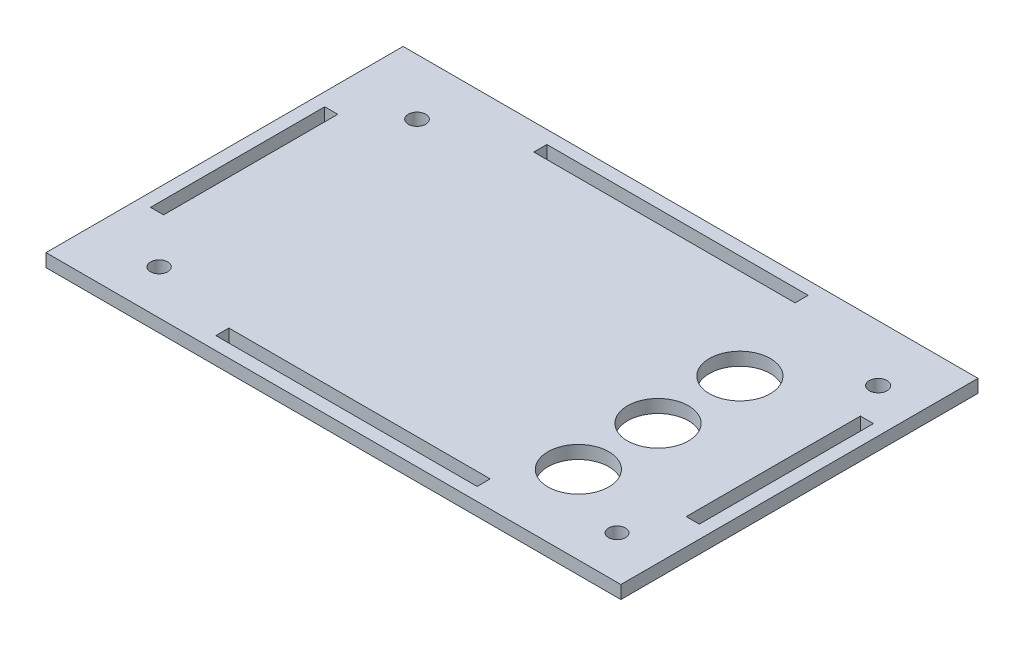
ISO-10303-21;
HEADER;
FILE_DESCRIPTION(('STEP AP214'),'2;1');
FILE_NAME('part.step','',(''),(''),'','','');
FILE_SCHEMA(('AUTOMOTIVE_DESIGN { 1 0 10303 214 1 1 1 1 }'));
ENDSEC;
DATA;
#1=APPLICATION_CONTEXT('core data for automotive mechanical design processes');
#2=APPLICATION_PROTOCOL_DEFINITION('international standard','automotive_design',2000,#1);
#3=PRODUCT_CONTEXT('',#1,'mechanical');
#4=PRODUCT('Part','Part','',(#3));
#5=PRODUCT_RELATED_PRODUCT_CATEGORY('part','',(#4));
#6=PRODUCT_DEFINITION_FORMATION('','',#4);
#7=PRODUCT_DEFINITION_CONTEXT('part definition',#1,'design');
#8=PRODUCT_DEFINITION('design','',#6,#7);
#9=PRODUCT_DEFINITION_SHAPE('','',#8);
#10=(LENGTH_UNIT() NAMED_UNIT(*) SI_UNIT(.MILLI.,.METRE.));
#11=(NAMED_UNIT(*) PLANE_ANGLE_UNIT() SI_UNIT($,.RADIAN.));
#12=(NAMED_UNIT(*) SI_UNIT($,.STERADIAN.) SOLID_ANGLE_UNIT());
#13=UNCERTAINTY_MEASURE_WITH_UNIT(LENGTH_MEASURE(1.E-05),#10,'distance_accuracy_value','');
#14=(GEOMETRIC_REPRESENTATION_CONTEXT(3) GLOBAL_UNCERTAINTY_ASSIGNED_CONTEXT((#13)) GLOBAL_UNIT_ASSIGNED_CONTEXT((#10,
#11,#12)) REPRESENTATION_CONTEXT('',''));
#15=CARTESIAN_POINT('',(0.,0.,0.));
#16=DIRECTION('',(0.,0.,1.));
#17=DIRECTION('',(1.,0.,0.));
#18=AXIS2_PLACEMENT_3D('',#15,#16,#17);
#19=CARTESIAN_POINT('',(0.,3.,0.));
#20=DIRECTION('',(0.,1.,0.));
#21=DIRECTION('',(0.,0.,1.));
#22=AXIS2_PLACEMENT_3D('',#19,#20,#21);
#23=PLANE('',#22);
#24=CARTESIAN_POINT('',(-21.7887973900198,3.,-30.3157877240987));
#25=DIRECTION('',(0.,1.,0.));
#26=DIRECTION('',(0.,0.,1.));
#27=AXIS2_PLACEMENT_3D('',#24,#25,#26);
#28=CIRCLE('',#27,7.);
#29=CARTESIAN_POINT('',(-21.7887973900198,3.,-23.3157877240987));
#30=VERTEX_POINT('',#29);
#31=EDGE_CURVE('E493',#30,#30,#28,.T.);
#32=ORIENTED_EDGE('',*,*,#31,.F.);
#33=EDGE_LOOP('',(#32));
#34=FACE_BOUND('',#33,.T.);
#35=CARTESIAN_POINT('',(-4.72023304277996,3.,-3.837756232131));
#36=DIRECTION('',(0.,1.,0.));
#37=DIRECTION('',(0.,0.,1.));
#38=AXIS2_PLACEMENT_3D('',#35,#36,#37);
#39=CIRCLE('',#38,1.9401466338825);
#40=CARTESIAN_POINT('',(-4.72023304277996,3.,-1.89760959824849));
#41=VERTEX_POINT('',#40);
#42=EDGE_CURVE('E505',#41,#41,#39,.T.);
#43=ORIENTED_EDGE('',*,*,#42,.F.);
#44=EDGE_LOOP('',(#43));
#45=FACE_BOUND('',#44,.T.);
#46=CARTESIAN_POINT('',(-110.18079739002,3.,-4.15478389289388));
#47=DIRECTION('',(0.,1.,0.));
#48=DIRECTION('',(0.,0.,1.));
#49=AXIS2_PLACEMENT_3D('',#46,#47,#48);
#50=CIRCLE('',#49,1.97327549457175);
#51=CARTESIAN_POINT('',(-110.18079739002,3.,-2.18150839832213));
#52=VERTEX_POINT('',#51);
#53=EDGE_CURVE('E517',#52,#52,#50,.T.);
#54=ORIENTED_EDGE('',*,*,#53,.F.);
#55=EDGE_LOOP('',(#54));
#56=FACE_BOUND('',#55,.T.);
#57=DIRECTION('',(1.,0.,0.));
#58=VECTOR('',#57,1.);
#59=CARTESIAN_POINT('',(-30.,3.,3.00000000000003));
#60=LINE('',#59,#58);
#61=CARTESIAN_POINT('',(-90.,3.,3.00000000000004));
#62=VERTEX_POINT('',#61);
#63=CARTESIAN_POINT('',(-30.,3.,3.00000000000003));
#64=VERTEX_POINT('',#63);
#65=EDGE_CURVE('E188',#62,#64,#60,.T.);
#66=ORIENTED_EDGE('',*,*,#65,.F.);
#67=DIRECTION('',(0.,0.,1.));
#68=VECTOR('',#67,1.);
#69=CARTESIAN_POINT('',(-90.,3.,3.00000000000004));
#70=LINE('',#69,#68);
#71=CARTESIAN_POINT('',(-90.,3.,0.));
#72=VERTEX_POINT('',#71);
#73=EDGE_CURVE('E180',#72,#62,#70,.T.);
#74=ORIENTED_EDGE('',*,*,#73,.F.);
#75=DIRECTION('',(-1.,0.,0.));
#76=VECTOR('',#75,1.);
#77=CARTESIAN_POINT('',(-30.,3.,0.));
#78=LINE('',#77,#76);
#79=CARTESIAN_POINT('',(-30.,3.,0.));
#80=VERTEX_POINT('',#79);
#81=EDGE_CURVE('E203',#80,#72,#78,.T.);
#82=ORIENTED_EDGE('',*,*,#81,.F.);
#83=DIRECTION('',(0.,0.,-1.));
#84=VECTOR('',#83,1.);
#85=CARTESIAN_POINT('',(-30.,3.,3.00000000000003));
#86=LINE('',#85,#84);
#87=EDGE_CURVE('E201',#64,#80,#86,.T.);
#88=ORIENTED_EDGE('',*,*,#87,.F.);
#89=EDGE_LOOP('',(#66,#74,#82,#88));
#90=FACE_BOUND('',#89,.T.);
#91=DIRECTION('',(1.,0.,0.));
#92=VECTOR('',#91,1.);
#93=CARTESIAN_POINT('',(-29.9999999999999,3.,-70.0000000000002));
#94=LINE('',#93,#92);
#95=CARTESIAN_POINT('',(-89.9999999999999,3.,-70.));
#96=VERTEX_POINT('',#95);
#97=CARTESIAN_POINT('',(-29.9999999999999,3.,-70.0000000000002));
#98=VERTEX_POINT('',#97);
#99=EDGE_CURVE('E221',#96,#98,#94,.T.);
#100=ORIENTED_EDGE('',*,*,#99,.F.);
#101=DIRECTION('',(0.,0.,1.));
#102=VECTOR('',#101,1.);
#103=CARTESIAN_POINT('',(-89.9999999999999,3.,-73.0000000000001));
#104=LINE('',#103,#102);
#105=CARTESIAN_POINT('',(-89.9999999999999,3.,-73.0000000000001));
#106=VERTEX_POINT('',#105);
#107=EDGE_CURVE('E219',#106,#96,#104,.T.);
#108=ORIENTED_EDGE('',*,*,#107,.F.);
#109=DIRECTION('',(-1.,0.,0.));
#110=VECTOR('',#109,1.);
#111=CARTESIAN_POINT('',(-29.9999999999999,3.,-73.0000000000001));
#112=LINE('',#111,#110);
#113=CARTESIAN_POINT('',(-29.9999999999999,3.,-73.0000000000001));
#114=VERTEX_POINT('',#113);
#115=EDGE_CURVE('E227',#114,#106,#112,.T.);
#116=ORIENTED_EDGE('',*,*,#115,.F.);
#117=DIRECTION('',(0.,0.,-1.));
#118=VECTOR('',#117,1.);
#119=CARTESIAN_POINT('',(-29.9999999999999,3.,-73.0000000000001));
#120=LINE('',#119,#118);
#121=EDGE_CURVE('E224',#98,#114,#120,.T.);
#122=ORIENTED_EDGE('',*,*,#121,.F.);
#123=EDGE_LOOP('',(#100,#108,#116,#122));
#124=FACE_BOUND('',#123,.T.);
#125=DIRECTION('',(-1.,0.,0.));
#126=VECTOR('',#125,1.);
#127=CARTESIAN_POINT('',(-123.,3.,-55.));
#128=LINE('',#127,#126);
#129=CARTESIAN_POINT('',(-120.,3.,-55.));
#130=VERTEX_POINT('',#129);
#131=CARTESIAN_POINT('',(-123.,3.,-55.));
#132=VERTEX_POINT('',#131);
#133=EDGE_CURVE('E252',#130,#132,#128,.T.);
#134=ORIENTED_EDGE('',*,*,#133,.F.);
#135=DIRECTION('',(0.,0.,-1.));
#136=VECTOR('',#135,1.);
#137=CARTESIAN_POINT('',(-120.,3.,-55.));
#138=LINE('',#137,#136);
#139=CARTESIAN_POINT('',(-120.,3.,-15.));
#140=VERTEX_POINT('',#139);
#141=EDGE_CURVE('E250',#140,#130,#138,.T.);
#142=ORIENTED_EDGE('',*,*,#141,.F.);
#143=DIRECTION('',(1.,0.,0.));
#144=VECTOR('',#143,1.);
#145=CARTESIAN_POINT('',(-123.,3.,-15.));
#146=LINE('',#145,#144);
#147=CARTESIAN_POINT('',(-123.,3.,-15.));
#148=VERTEX_POINT('',#147);
#149=EDGE_CURVE('E258',#148,#140,#146,.T.);
#150=ORIENTED_EDGE('',*,*,#149,.F.);
#151=DIRECTION('',(0.,0.,1.));
#152=VECTOR('',#151,1.);
#153=CARTESIAN_POINT('',(-123.,3.,-55.));
#154=LINE('',#153,#152);
#155=EDGE_CURVE('E255',#132,#148,#154,.T.);
#156=ORIENTED_EDGE('',*,*,#155,.F.);
#157=EDGE_LOOP('',(#134,#142,#150,#156));
#158=FACE_BOUND('',#157,.T.);
#159=DIRECTION('',(1.,0.,0.));
#160=VECTOR('',#159,1.);
#161=CARTESIAN_POINT('',(3.00000000000011,3.,-15.));
#162=LINE('',#161,#160);
#163=CARTESIAN_POINT('',(0.,3.,-15.));
#164=VERTEX_POINT('',#163);
#165=CARTESIAN_POINT('',(3.00000000000011,3.,-15.));
#166=VERTEX_POINT('',#165);
#167=EDGE_CURVE('E283',#164,#166,#162,.T.);
#168=ORIENTED_EDGE('',*,*,#167,.F.);
#169=DIRECTION('',(0.,0.,1.));
#170=VECTOR('',#169,1.);
#171=CARTESIAN_POINT('',(0.,3.,-55.));
#172=LINE('',#171,#170);
#173=CARTESIAN_POINT('',(0.,3.,-55.));
#174=VERTEX_POINT('',#173);
#175=EDGE_CURVE('E281',#174,#164,#172,.T.);
#176=ORIENTED_EDGE('',*,*,#175,.F.);
#177=DIRECTION('',(-1.,0.,0.));
#178=VECTOR('',#177,1.);
#179=CARTESIAN_POINT('',(3.00000000000001,3.,-55.));
#180=LINE('',#179,#178);
#181=CARTESIAN_POINT('',(3.00000000000001,3.,-55.));
#182=VERTEX_POINT('',#181);
#183=EDGE_CURVE('E289',#182,#174,#180,.T.);
#184=ORIENTED_EDGE('',*,*,#183,.F.);
#185=DIRECTION('',(0.,0.,-1.));
#186=VECTOR('',#185,1.);
#187=CARTESIAN_POINT('',(3.00000000000001,3.,-55.));
#188=LINE('',#187,#186);
#189=EDGE_CURVE('E286',#166,#182,#188,.T.);
#190=ORIENTED_EDGE('',*,*,#189,.F.);
#191=EDGE_LOOP('',(#168,#176,#184,#190));
#192=FACE_BOUND('',#191,.T.);
#193=DIRECTION('',(0.,0.,-1.));
#194=VECTOR('',#193,1.);
#195=CARTESIAN_POINT('',(6.,3.,5.99999999999998));
#196=LINE('',#195,#194);
#197=CARTESIAN_POINT('',(6.,3.,5.99999999999998));
#198=VERTEX_POINT('',#197);
#199=CARTESIAN_POINT('',(6.,3.,-76.0000000000001));
#200=VERTEX_POINT('',#199);
#201=EDGE_CURVE('E312',#198,#200,#196,.T.);
#202=ORIENTED_EDGE('',*,*,#201,.T.);
#203=DIRECTION('',(-1.,0.,0.));
#204=VECTOR('',#203,1.);
#205=CARTESIAN_POINT('',(6.,3.,-76.0000000000001));
#206=LINE('',#205,#204);
#207=CARTESIAN_POINT('',(-126.,3.,-76.0000000000001));
#208=VERTEX_POINT('',#207);
#209=EDGE_CURVE('E315',#200,#208,#206,.T.);
#210=ORIENTED_EDGE('',*,*,#209,.T.);
#211=DIRECTION('',(0.,0.,1.));
#212=VECTOR('',#211,1.);
#213=CARTESIAN_POINT('',(-126.,3.,6.));
#214=LINE('',#213,#212);
#215=CARTESIAN_POINT('',(-126.,3.,6.));
#216=VERTEX_POINT('',#215);
#217=EDGE_CURVE('E318',#208,#216,#214,.T.);
#218=ORIENTED_EDGE('',*,*,#217,.T.);
#219=DIRECTION('',(1.,0.,0.));
#220=VECTOR('',#219,1.);
#221=CARTESIAN_POINT('',(6.,3.,5.99999999999998));
#222=LINE('',#221,#220);
#223=EDGE_CURVE('E320',#216,#198,#222,.T.);
#224=ORIENTED_EDGE('',*,*,#223,.T.);
#225=EDGE_LOOP('',(#202,#210,#218,#224));
#226=FACE_BOUND('',#225,.T.);
#227=CARTESIAN_POINT('',(-109.92679739002,3.,-63.1137881954682));
#228=DIRECTION('',(0.,1.,0.));
#229=DIRECTION('',(0.,0.,1.));
#230=AXIS2_PLACEMENT_3D('',#227,#228,#229);
#231=CIRCLE('',#230,2.00659999999999);
#232=CARTESIAN_POINT('',(-109.92679739002,3.,-61.1071881954682));
#233=VERTEX_POINT('',#232);
#234=EDGE_CURVE('E209',#233,#233,#231,.T.);
#235=ORIENTED_EDGE('',*,*,#234,.F.);
#236=EDGE_LOOP('',(#235));
#237=FACE_BOUND('',#236,.T.);
#238=CARTESIAN_POINT('',(-4.00427744735474,3.,-63.0805400952194));
#239=DIRECTION('',(0.,1.,0.));
#240=DIRECTION('',(0.,0.,1.));
#241=AXIS2_PLACEMENT_3D('',#238,#239,#240);
#242=CIRCLE('',#241,2.03767912548017);
#243=CARTESIAN_POINT('',(-4.00427744735474,3.,-61.0428609697392));
#244=VERTEX_POINT('',#243);
#245=EDGE_CURVE('E511',#244,#244,#242,.T.);
#246=ORIENTED_EDGE('',*,*,#245,.F.);
#247=EDGE_LOOP('',(#246));
#248=FACE_BOUND('',#247,.T.);
#249=CARTESIAN_POINT('',(-21.7887973900198,3.,-49.1110720300129));
#250=DIRECTION('',(0.,1.,0.));
#251=DIRECTION('',(0.,0.,1.));
#252=AXIS2_PLACEMENT_3D('',#249,#250,#251);
#253=CIRCLE('',#252,7.);
#254=CARTESIAN_POINT('',(-21.7887973900198,3.,-42.1110720300129));
#255=VERTEX_POINT('',#254);
#256=EDGE_CURVE('E499',#255,#255,#253,.T.);
#257=ORIENTED_EDGE('',*,*,#256,.F.);
#258=EDGE_LOOP('',(#257));
#259=FACE_BOUND('',#258,.T.);
#260=CARTESIAN_POINT('',(-21.7887973900198,3.,-12.0284840751012));
#261=DIRECTION('',(0.,1.,0.));
#262=DIRECTION('',(0.,0.,1.));
#263=AXIS2_PLACEMENT_3D('',#260,#261,#262);
#264=CIRCLE('',#263,7.);
#265=CARTESIAN_POINT('',(-21.7887973900198,3.,-5.02848407510115));
#266=VERTEX_POINT('',#265);
#267=EDGE_CURVE('E484',#266,#266,#264,.T.);
#268=ORIENTED_EDGE('',*,*,#267,.F.);
#269=EDGE_LOOP('',(#268));
#270=FACE_BOUND('',#269,.T.);
#271=ADVANCED_FACE('F43',(#34,#45,#56,#90,#124,#158,#192,#226,#237,#248,#259,#270),#23,.T.);
#272=CARTESIAN_POINT('',(0.,0.,0.));
#273=DIRECTION('',(0.,1.,0.));
#274=DIRECTION('',(0.,0.,1.));
#275=AXIS2_PLACEMENT_3D('',#272,#273,#274);
#276=PLANE('',#275);
#277=DIRECTION('',(0.,0.,1.));
#278=VECTOR('',#277,1.);
#279=CARTESIAN_POINT('',(-89.9999999999999,0.,-73.0000000000001));
#280=LINE('',#279,#278);
#281=CARTESIAN_POINT('',(-89.9999999999999,0.,-73.0000000000001));
#282=VERTEX_POINT('',#281);
#283=CARTESIAN_POINT('',(-89.9999999999999,0.,-70.));
#284=VERTEX_POINT('',#283);
#285=EDGE_CURVE('E196',#282,#284,#280,.T.);
#286=ORIENTED_EDGE('',*,*,#285,.T.);
#287=DIRECTION('',(1.,0.,0.));
#288=VECTOR('',#287,1.);
#289=CARTESIAN_POINT('',(-29.9999999999999,0.,-70.0000000000002));
#290=LINE('',#289,#288);
#291=CARTESIAN_POINT('',(-29.9999999999999,0.,-70.0000000000002));
#292=VERTEX_POINT('',#291);
#293=EDGE_CURVE('E232',#284,#292,#290,.T.);
#294=ORIENTED_EDGE('',*,*,#293,.T.);
#295=DIRECTION('',(0.,0.,-1.));
#296=VECTOR('',#295,1.);
#297=CARTESIAN_POINT('',(-29.9999999999999,0.,-73.0000000000001));
#298=LINE('',#297,#296);
#299=CARTESIAN_POINT('',(-29.9999999999999,0.,-73.0000000000001));
#300=VERTEX_POINT('',#299);
#301=EDGE_CURVE('E235',#292,#300,#298,.T.);
#302=ORIENTED_EDGE('',*,*,#301,.T.);
#303=DIRECTION('',(-1.,0.,0.));
#304=VECTOR('',#303,1.);
#305=CARTESIAN_POINT('',(-29.9999999999999,0.,-73.0000000000001));
#306=LINE('',#305,#304);
#307=EDGE_CURVE('E222',#300,#282,#306,.T.);
#308=ORIENTED_EDGE('',*,*,#307,.T.);
#309=EDGE_LOOP('',(#286,#294,#302,#308));
#310=FACE_BOUND('',#309,.T.);
#311=DIRECTION('',(0.,0.,1.));
#312=VECTOR('',#311,1.);
#313=CARTESIAN_POINT('',(0.,0.,-55.));
#314=LINE('',#313,#312);
#315=CARTESIAN_POINT('',(0.,0.,-55.));
#316=VERTEX_POINT('',#315);
#317=CARTESIAN_POINT('',(0.,0.,-15.));
#318=VERTEX_POINT('',#317);
#319=EDGE_CURVE('E280',#316,#318,#314,.T.);
#320=ORIENTED_EDGE('',*,*,#319,.T.);
#321=DIRECTION('',(1.,0.,0.));
#322=VECTOR('',#321,1.);
#323=CARTESIAN_POINT('',(3.00000000000011,0.,-15.));
#324=LINE('',#323,#322);
#325=CARTESIAN_POINT('',(3.00000000000011,0.,-15.));
#326=VERTEX_POINT('',#325);
#327=EDGE_CURVE('E294',#318,#326,#324,.T.);
#328=ORIENTED_EDGE('',*,*,#327,.T.);
#329=DIRECTION('',(0.,0.,-1.));
#330=VECTOR('',#329,1.);
#331=CARTESIAN_POINT('',(3.00000000000001,0.,-55.));
#332=LINE('',#331,#330);
#333=CARTESIAN_POINT('',(3.00000000000001,0.,-55.));
#334=VERTEX_POINT('',#333);
#335=EDGE_CURVE('E297',#326,#334,#332,.T.);
#336=ORIENTED_EDGE('',*,*,#335,.T.);
#337=DIRECTION('',(-1.,0.,0.));
#338=VECTOR('',#337,1.);
#339=CARTESIAN_POINT('',(3.00000000000001,0.,-55.));
#340=LINE('',#339,#338);
#341=EDGE_CURVE('E284',#334,#316,#340,.T.);
#342=ORIENTED_EDGE('',*,*,#341,.T.);
#343=EDGE_LOOP('',(#320,#328,#336,#342));
#344=FACE_BOUND('',#343,.T.);
#345=DIRECTION('',(0.,0.,-1.));
#346=VECTOR('',#345,1.);
#347=CARTESIAN_POINT('',(6.,0.,5.99999999999998));
#348=LINE('',#347,#346);
#349=CARTESIAN_POINT('',(6.,0.,5.99999999999998));
#350=VERTEX_POINT('',#349);
#351=CARTESIAN_POINT('',(6.,0.,-76.0000000000001));
#352=VERTEX_POINT('',#351);
#353=EDGE_CURVE('E311',#350,#352,#348,.T.);
#354=ORIENTED_EDGE('',*,*,#353,.F.);
#355=DIRECTION('',(1.,0.,0.));
#356=VECTOR('',#355,1.);
#357=CARTESIAN_POINT('',(6.,0.,5.99999999999998));
#358=LINE('',#357,#356);
#359=CARTESIAN_POINT('',(-126.,0.,6.));
#360=VERTEX_POINT('',#359);
#361=EDGE_CURVE('E316',#360,#350,#358,.T.);
#362=ORIENTED_EDGE('',*,*,#361,.F.);
#363=DIRECTION('',(0.,0.,1.));
#364=VECTOR('',#363,1.);
#365=CARTESIAN_POINT('',(-126.,0.,6.));
#366=LINE('',#365,#364);
#367=CARTESIAN_POINT('',(-126.,0.,-76.0000000000001));
#368=VERTEX_POINT('',#367);
#369=EDGE_CURVE('E327',#368,#360,#366,.T.);
#370=ORIENTED_EDGE('',*,*,#369,.F.);
#371=DIRECTION('',(-1.,0.,0.));
#372=VECTOR('',#371,1.);
#373=CARTESIAN_POINT('',(6.,0.,-76.0000000000001));
#374=LINE('',#373,#372);
#375=EDGE_CURVE('E325',#352,#368,#374,.T.);
#376=ORIENTED_EDGE('',*,*,#375,.F.);
#377=EDGE_LOOP('',(#354,#362,#370,#376));
#378=FACE_BOUND('',#377,.T.);
#379=DIRECTION('',(0.,0.,-1.));
#380=VECTOR('',#379,1.);
#381=CARTESIAN_POINT('',(-120.,0.,-55.));
#382=LINE('',#381,#380);
#383=CARTESIAN_POINT('',(-120.,0.,-15.));
#384=VERTEX_POINT('',#383);
#385=CARTESIAN_POINT('',(-120.,0.,-55.));
#386=VERTEX_POINT('',#385);
#387=EDGE_CURVE('E249',#384,#386,#382,.T.);
#388=ORIENTED_EDGE('',*,*,#387,.T.);
#389=DIRECTION('',(-1.,0.,0.));
#390=VECTOR('',#389,1.);
#391=CARTESIAN_POINT('',(-123.,0.,-55.));
#392=LINE('',#391,#390);
#393=CARTESIAN_POINT('',(-123.,0.,-55.));
#394=VERTEX_POINT('',#393);
#395=EDGE_CURVE('E263',#386,#394,#392,.T.);
#396=ORIENTED_EDGE('',*,*,#395,.T.);
#397=DIRECTION('',(0.,0.,1.));
#398=VECTOR('',#397,1.);
#399=CARTESIAN_POINT('',(-123.,0.,-55.));
#400=LINE('',#399,#398);
#401=CARTESIAN_POINT('',(-123.,0.,-15.));
#402=VERTEX_POINT('',#401);
#403=EDGE_CURVE('E266',#394,#402,#400,.T.);
#404=ORIENTED_EDGE('',*,*,#403,.T.);
#405=DIRECTION('',(1.,0.,0.));
#406=VECTOR('',#405,1.);
#407=CARTESIAN_POINT('',(-123.,0.,-15.));
#408=LINE('',#407,#406);
#409=EDGE_CURVE('E253',#402,#384,#408,.T.);
#410=ORIENTED_EDGE('',*,*,#409,.T.);
#411=EDGE_LOOP('',(#388,#396,#404,#410));
#412=FACE_BOUND('',#411,.T.);
#413=DIRECTION('',(0.,0.,1.));
#414=VECTOR('',#413,1.);
#415=CARTESIAN_POINT('',(-90.,0.,3.00000000000004));
#416=LINE('',#415,#414);
#417=CARTESIAN_POINT('',(-90.,0.,0.));
#418=VERTEX_POINT('',#417);
#419=CARTESIAN_POINT('',(-90.,0.,3.00000000000004));
#420=VERTEX_POINT('',#419);
#421=EDGE_CURVE('E66',#418,#420,#416,.T.);
#422=ORIENTED_EDGE('',*,*,#421,.T.);
#423=DIRECTION('',(1.,0.,0.));
#424=VECTOR('',#423,1.);
#425=CARTESIAN_POINT('',(-30.,0.,3.00000000000003));
#426=LINE('',#425,#424);
#427=CARTESIAN_POINT('',(-30.,0.,3.00000000000003));
#428=VERTEX_POINT('',#427);
#429=EDGE_CURVE('E195',#420,#428,#426,.T.);
#430=ORIENTED_EDGE('',*,*,#429,.T.);
#431=DIRECTION('',(0.,0.,-1.));
#432=VECTOR('',#431,1.);
#433=CARTESIAN_POINT('',(-30.,0.,3.00000000000003));
#434=LINE('',#433,#432);
#435=CARTESIAN_POINT('',(-30.,0.,0.));
#436=VERTEX_POINT('',#435);
#437=EDGE_CURVE('E211',#428,#436,#434,.T.);
#438=ORIENTED_EDGE('',*,*,#437,.T.);
#439=DIRECTION('',(-1.,0.,0.));
#440=VECTOR('',#439,1.);
#441=CARTESIAN_POINT('',(-30.,0.,0.));
#442=LINE('',#441,#440);
#443=EDGE_CURVE('E189',#436,#418,#442,.T.);
#444=ORIENTED_EDGE('',*,*,#443,.T.);
#445=EDGE_LOOP('',(#422,#430,#438,#444));
#446=FACE_BOUND('',#445,.T.);
#447=CARTESIAN_POINT('',(-109.92679739002,0.,-63.1137881954682));
#448=DIRECTION('',(0.,1.,0.));
#449=DIRECTION('',(0.,0.,1.));
#450=AXIS2_PLACEMENT_3D('',#447,#448,#449);
#451=CIRCLE('',#450,2.00659999999999);
#452=CARTESIAN_POINT('',(-109.92679739002,0.,-61.1071881954682));
#453=VERTEX_POINT('',#452);
#454=EDGE_CURVE('E520',#453,#453,#451,.T.);
#455=ORIENTED_EDGE('',*,*,#454,.T.);
#456=EDGE_LOOP('',(#455));
#457=FACE_BOUND('',#456,.T.);
#458=CARTESIAN_POINT('',(-110.18079739002,0.,-4.15478389289388));
#459=DIRECTION('',(0.,1.,0.));
#460=DIRECTION('',(0.,0.,1.));
#461=AXIS2_PLACEMENT_3D('',#458,#459,#460);
#462=CIRCLE('',#461,1.97327549457175);
#463=CARTESIAN_POINT('',(-110.18079739002,0.,-2.18150839832213));
#464=VERTEX_POINT('',#463);
#465=EDGE_CURVE('E514',#464,#464,#462,.T.);
#466=ORIENTED_EDGE('',*,*,#465,.T.);
#467=EDGE_LOOP('',(#466));
#468=FACE_BOUND('',#467,.T.);
#469=CARTESIAN_POINT('',(-4.00427744735474,0.,-63.0805400952194));
#470=DIRECTION('',(0.,1.,0.));
#471=DIRECTION('',(0.,0.,1.));
#472=AXIS2_PLACEMENT_3D('',#469,#470,#471);
#473=CIRCLE('',#472,2.03767912548017);
#474=CARTESIAN_POINT('',(-4.00427744735474,0.,-61.0428609697392));
#475=VERTEX_POINT('',#474);
#476=EDGE_CURVE('E508',#475,#475,#473,.T.);
#477=ORIENTED_EDGE('',*,*,#476,.T.);
#478=EDGE_LOOP('',(#477));
#479=FACE_BOUND('',#478,.T.);
#480=CARTESIAN_POINT('',(-4.72023304277996,0.,-3.837756232131));
#481=DIRECTION('',(0.,1.,0.));
#482=DIRECTION('',(0.,0.,1.));
#483=AXIS2_PLACEMENT_3D('',#480,#481,#482);
#484=CIRCLE('',#483,1.9401466338825);
#485=CARTESIAN_POINT('',(-4.72023304277996,0.,-1.89760959824849));
#486=VERTEX_POINT('',#485);
#487=EDGE_CURVE('E502',#486,#486,#484,.T.);
#488=ORIENTED_EDGE('',*,*,#487,.T.);
#489=EDGE_LOOP('',(#488));
#490=FACE_BOUND('',#489,.T.);
#491=CARTESIAN_POINT('',(-21.7887973900198,0.,-49.1110720300129));
#492=DIRECTION('',(0.,1.,0.));
#493=DIRECTION('',(0.,0.,1.));
#494=AXIS2_PLACEMENT_3D('',#491,#492,#493);
#495=CIRCLE('',#494,7.);
#496=CARTESIAN_POINT('',(-21.7887973900198,0.,-42.1110720300129));
#497=VERTEX_POINT('',#496);
#498=EDGE_CURVE('E496',#497,#497,#495,.T.);
#499=ORIENTED_EDGE('',*,*,#498,.T.);
#500=EDGE_LOOP('',(#499));
#501=FACE_BOUND('',#500,.T.);
#502=CARTESIAN_POINT('',(-21.7887973900198,0.,-30.3157877240987));
#503=DIRECTION('',(0.,1.,0.));
#504=DIRECTION('',(0.,0.,1.));
#505=AXIS2_PLACEMENT_3D('',#502,#503,#504);
#506=CIRCLE('',#505,7.);
#507=CARTESIAN_POINT('',(-21.7887973900198,0.,-23.3157877240987));
#508=VERTEX_POINT('',#507);
#509=EDGE_CURVE('E490',#508,#508,#506,.T.);
#510=ORIENTED_EDGE('',*,*,#509,.T.);
#511=EDGE_LOOP('',(#510));
#512=FACE_BOUND('',#511,.T.);
#513=CARTESIAN_POINT('',(-21.7887973900198,0.,-12.0284840751012));
#514=DIRECTION('',(0.,1.,0.));
#515=DIRECTION('',(0.,0.,1.));
#516=AXIS2_PLACEMENT_3D('',#513,#514,#515);
#517=CIRCLE('',#516,7.);
#518=CARTESIAN_POINT('',(-21.7887973900198,0.,-5.02848407510115));
#519=VERTEX_POINT('',#518);
#520=EDGE_CURVE('E487',#519,#519,#517,.T.);
#521=ORIENTED_EDGE('',*,*,#520,.T.);
#522=EDGE_LOOP('',(#521));
#523=FACE_BOUND('',#522,.T.);
#524=ADVANCED_FACE('F345',(#310,#344,#378,#412,#446,#457,#468,#479,#490,#501,#512,#523),#276,.F.);
#525=CARTESIAN_POINT('',(6.,3.,5.99999999999998));
#526=DIRECTION('',(-1.,0.,0.));
#527=DIRECTION('',(0.,0.,1.));
#528=AXIS2_PLACEMENT_3D('',#525,#526,#527);
#529=PLANE('',#528);
#530=ORIENTED_EDGE('',*,*,#353,.T.);
#531=DIRECTION('',(0.,-1.,0.));
#532=VECTOR('',#531,1.);
#533=CARTESIAN_POINT('',(6.,3.,-76.0000000000001));
#534=LINE('',#533,#532);
#535=EDGE_CURVE('E13',#200,#352,#534,.T.);
#536=ORIENTED_EDGE('',*,*,#535,.F.);
#537=ORIENTED_EDGE('',*,*,#201,.F.);
#538=DIRECTION('',(0.,-1.,0.));
#539=VECTOR('',#538,1.);
#540=CARTESIAN_POINT('',(6.,3.,5.99999999999998));
#541=LINE('',#540,#539);
#542=EDGE_CURVE('E322',#198,#350,#541,.T.);
#543=ORIENTED_EDGE('',*,*,#542,.T.);
#544=EDGE_LOOP('',(#530,#536,#537,#543));
#545=FACE_BOUND('',#544,.T.);
#546=ADVANCED_FACE('F45',(#545),#529,.F.);
#547=CARTESIAN_POINT('',(6.,3.,-76.0000000000001));
#548=DIRECTION('',(0.,0.,1.));
#549=DIRECTION('',(1.,0.,0.));
#550=AXIS2_PLACEMENT_3D('',#547,#548,#549);
#551=PLANE('',#550);
#552=ORIENTED_EDGE('',*,*,#375,.T.);
#553=DIRECTION('',(0.,-1.,0.));
#554=VECTOR('',#553,1.);
#555=CARTESIAN_POINT('',(-126.,3.,-76.0000000000001));
#556=LINE('',#555,#554);
#557=EDGE_CURVE('E51',#208,#368,#556,.T.);
#558=ORIENTED_EDGE('',*,*,#557,.F.);
#559=ORIENTED_EDGE('',*,*,#209,.F.);
#560=ORIENTED_EDGE('',*,*,#535,.T.);
#561=EDGE_LOOP('',(#552,#558,#559,#560));
#562=FACE_BOUND('',#561,.T.);
#563=ADVANCED_FACE('F356',(#562),#551,.F.);
#564=CARTESIAN_POINT('',(-126.,3.,6.));
#565=DIRECTION('',(1.,0.,0.));
#566=DIRECTION('',(0.,0.,-1.));
#567=AXIS2_PLACEMENT_3D('',#564,#565,#566);
#568=PLANE('',#567);
#569=ORIENTED_EDGE('',*,*,#369,.T.);
#570=DIRECTION('',(0.,-1.,0.));
#571=VECTOR('',#570,1.);
#572=CARTESIAN_POINT('',(-126.,3.,6.));
#573=LINE('',#572,#571);
#574=EDGE_CURVE('E332',#216,#360,#573,.T.);
#575=ORIENTED_EDGE('',*,*,#574,.F.);
#576=ORIENTED_EDGE('',*,*,#217,.F.);
#577=ORIENTED_EDGE('',*,*,#557,.T.);
#578=EDGE_LOOP('',(#569,#575,#576,#577));
#579=FACE_BOUND('',#578,.T.);
#580=ADVANCED_FACE('F339',(#579),#568,.F.);
#581=CARTESIAN_POINT('',(6.,3.,5.99999999999998));
#582=DIRECTION('',(0.,0.,-1.));
#583=DIRECTION('',(-1.,0.,0.));
#584=AXIS2_PLACEMENT_3D('',#581,#582,#583);
#585=PLANE('',#584);
#586=ORIENTED_EDGE('',*,*,#361,.T.);
#587=ORIENTED_EDGE('',*,*,#542,.F.);
#588=ORIENTED_EDGE('',*,*,#223,.F.);
#589=ORIENTED_EDGE('',*,*,#574,.T.);
#590=EDGE_LOOP('',(#586,#587,#588,#589));
#591=FACE_BOUND('',#590,.T.);
#592=ADVANCED_FACE('F349',(#591),#585,.F.);
#593=CARTESIAN_POINT('',(0.,3.,-55.));
#594=DIRECTION('',(1.,0.,0.));
#595=DIRECTION('',(0.,0.,-1.));
#596=AXIS2_PLACEMENT_3D('',#593,#594,#595);
#597=PLANE('',#596);
#598=ORIENTED_EDGE('',*,*,#319,.F.);
#599=DIRECTION('',(0.,-1.,0.));
#600=VECTOR('',#599,1.);
#601=CARTESIAN_POINT('',(0.,3.,-55.));
#602=LINE('',#601,#600);
#603=EDGE_CURVE('E291',#174,#316,#602,.T.);
#604=ORIENTED_EDGE('',*,*,#603,.F.);
#605=ORIENTED_EDGE('',*,*,#175,.T.);
#606=DIRECTION('',(0.,-1.,0.));
#607=VECTOR('',#606,1.);
#608=CARTESIAN_POINT('',(0.,3.,-15.));
#609=LINE('',#608,#607);
#610=EDGE_CURVE('E308',#164,#318,#609,.T.);
#611=ORIENTED_EDGE('',*,*,#610,.T.);
#612=EDGE_LOOP('',(#598,#604,#605,#611));
#613=FACE_BOUND('',#612,.T.);
#614=ADVANCED_FACE('F374',(#613),#597,.T.);
#615=CARTESIAN_POINT('',(3.00000000000011,3.,-15.));
#616=DIRECTION('',(0.,0.,-1.));
#617=DIRECTION('',(-1.,0.,0.));
#618=AXIS2_PLACEMENT_3D('',#615,#616,#617);
#619=PLANE('',#618);
#620=ORIENTED_EDGE('',*,*,#327,.F.);
#621=ORIENTED_EDGE('',*,*,#610,.F.);
#622=ORIENTED_EDGE('',*,*,#167,.T.);
#623=DIRECTION('',(0.,-1.,0.));
#624=VECTOR('',#623,1.);
#625=CARTESIAN_POINT('',(3.00000000000011,3.,-15.));
#626=LINE('',#625,#624);
#627=EDGE_CURVE('E306',#166,#326,#626,.T.);
#628=ORIENTED_EDGE('',*,*,#627,.T.);
#629=EDGE_LOOP('',(#620,#621,#622,#628));
#630=FACE_BOUND('',#629,.T.);
#631=ADVANCED_FACE('F381',(#630),#619,.T.);
#632=CARTESIAN_POINT('',(3.00000000000001,3.,-55.));
#633=DIRECTION('',(-1.,0.,0.));
#634=DIRECTION('',(0.,0.,1.));
#635=AXIS2_PLACEMENT_3D('',#632,#633,#634);
#636=PLANE('',#635);
#637=ORIENTED_EDGE('',*,*,#335,.F.);
#638=ORIENTED_EDGE('',*,*,#627,.F.);
#639=ORIENTED_EDGE('',*,*,#189,.T.);
#640=DIRECTION('',(0.,-1.,0.));
#641=VECTOR('',#640,1.);
#642=CARTESIAN_POINT('',(3.00000000000001,3.,-55.));
#643=LINE('',#642,#641);
#644=EDGE_CURVE('E304',#182,#334,#643,.T.);
#645=ORIENTED_EDGE('',*,*,#644,.T.);
#646=EDGE_LOOP('',(#637,#638,#639,#645));
#647=FACE_BOUND('',#646,.T.);
#648=ADVANCED_FACE('F386',(#647),#636,.T.);
#649=CARTESIAN_POINT('',(3.00000000000001,3.,-55.));
#650=DIRECTION('',(0.,0.,1.));
#651=DIRECTION('',(1.,0.,0.));
#652=AXIS2_PLACEMENT_3D('',#649,#650,#651);
#653=PLANE('',#652);
#654=ORIENTED_EDGE('',*,*,#341,.F.);
#655=ORIENTED_EDGE('',*,*,#644,.F.);
#656=ORIENTED_EDGE('',*,*,#183,.T.);
#657=ORIENTED_EDGE('',*,*,#603,.T.);
#658=EDGE_LOOP('',(#654,#655,#656,#657));
#659=FACE_BOUND('',#658,.T.);
#660=ADVANCED_FACE('F394',(#659),#653,.T.);
#661=CARTESIAN_POINT('',(-120.,3.,-55.));
#662=DIRECTION('',(-1.,0.,0.));
#663=DIRECTION('',(0.,0.,1.));
#664=AXIS2_PLACEMENT_3D('',#661,#662,#663);
#665=PLANE('',#664);
#666=ORIENTED_EDGE('',*,*,#387,.F.);
#667=DIRECTION('',(0.,-1.,0.));
#668=VECTOR('',#667,1.);
#669=CARTESIAN_POINT('',(-120.,3.,-15.));
#670=LINE('',#669,#668);
#671=EDGE_CURVE('E260',#140,#384,#670,.T.);
#672=ORIENTED_EDGE('',*,*,#671,.F.);
#673=ORIENTED_EDGE('',*,*,#141,.T.);
#674=DIRECTION('',(0.,-1.,0.));
#675=VECTOR('',#674,1.);
#676=CARTESIAN_POINT('',(-120.,3.,-55.));
#677=LINE('',#676,#675);
#678=EDGE_CURVE('E277',#130,#386,#677,.T.);
#679=ORIENTED_EDGE('',*,*,#678,.T.);
#680=EDGE_LOOP('',(#666,#672,#673,#679));
#681=FACE_BOUND('',#680,.T.);
#682=ADVANCED_FACE('F407',(#681),#665,.T.);
#683=CARTESIAN_POINT('',(-123.,3.,-55.));
#684=DIRECTION('',(0.,0.,1.));
#685=DIRECTION('',(1.,0.,0.));
#686=AXIS2_PLACEMENT_3D('',#683,#684,#685);
#687=PLANE('',#686);
#688=ORIENTED_EDGE('',*,*,#395,.F.);
#689=ORIENTED_EDGE('',*,*,#678,.F.);
#690=ORIENTED_EDGE('',*,*,#133,.T.);
#691=DIRECTION('',(0.,-1.,0.));
#692=VECTOR('',#691,1.);
#693=CARTESIAN_POINT('',(-123.,3.,-55.));
#694=LINE('',#693,#692);
#695=EDGE_CURVE('E275',#132,#394,#694,.T.);
#696=ORIENTED_EDGE('',*,*,#695,.T.);
#697=EDGE_LOOP('',(#688,#689,#690,#696));
#698=FACE_BOUND('',#697,.T.);
#699=ADVANCED_FACE('F412',(#698),#687,.T.);
#700=CARTESIAN_POINT('',(-123.,3.,-55.));
#701=DIRECTION('',(1.,0.,0.));
#702=DIRECTION('',(0.,0.,-1.));
#703=AXIS2_PLACEMENT_3D('',#700,#701,#702);
#704=PLANE('',#703);
#705=ORIENTED_EDGE('',*,*,#403,.F.);
#706=ORIENTED_EDGE('',*,*,#695,.F.);
#707=ORIENTED_EDGE('',*,*,#155,.T.);
#708=DIRECTION('',(0.,-1.,0.));
#709=VECTOR('',#708,1.);
#710=CARTESIAN_POINT('',(-123.,3.,-15.));
#711=LINE('',#710,#709);
#712=EDGE_CURVE('E273',#148,#402,#711,.T.);
#713=ORIENTED_EDGE('',*,*,#712,.T.);
#714=EDGE_LOOP('',(#705,#706,#707,#713));
#715=FACE_BOUND('',#714,.T.);
#716=ADVANCED_FACE('F416',(#715),#704,.T.);
#717=CARTESIAN_POINT('',(-123.,3.,-15.));
#718=DIRECTION('',(0.,0.,-1.));
#719=DIRECTION('',(-1.,0.,0.));
#720=AXIS2_PLACEMENT_3D('',#717,#718,#719);
#721=PLANE('',#720);
#722=ORIENTED_EDGE('',*,*,#409,.F.);
#723=ORIENTED_EDGE('',*,*,#712,.F.);
#724=ORIENTED_EDGE('',*,*,#149,.T.);
#725=ORIENTED_EDGE('',*,*,#671,.T.);
#726=EDGE_LOOP('',(#722,#723,#724,#725));
#727=FACE_BOUND('',#726,.T.);
#728=ADVANCED_FACE('F420',(#727),#721,.T.);
#729=CARTESIAN_POINT('',(-89.9999999999999,3.,-73.0000000000001));
#730=DIRECTION('',(1.,0.,0.));
#731=DIRECTION('',(0.,0.,-1.));
#732=AXIS2_PLACEMENT_3D('',#729,#730,#731);
#733=PLANE('',#732);
#734=ORIENTED_EDGE('',*,*,#285,.F.);
#735=DIRECTION('',(0.,-1.,0.));
#736=VECTOR('',#735,1.);
#737=CARTESIAN_POINT('',(-89.9999999999999,3.,-73.0000000000001));
#738=LINE('',#737,#736);
#739=EDGE_CURVE('E229',#106,#282,#738,.T.);
#740=ORIENTED_EDGE('',*,*,#739,.F.);
#741=ORIENTED_EDGE('',*,*,#107,.T.);
#742=DIRECTION('',(0.,-1.,0.));
#743=VECTOR('',#742,1.);
#744=CARTESIAN_POINT('',(-89.9999999999999,3.,-70.));
#745=LINE('',#744,#743);
#746=EDGE_CURVE('E246',#96,#284,#745,.T.);
#747=ORIENTED_EDGE('',*,*,#746,.T.);
#748=EDGE_LOOP('',(#734,#740,#741,#747));
#749=FACE_BOUND('',#748,.T.);
#750=ADVANCED_FACE('F424',(#749),#733,.T.);
#751=CARTESIAN_POINT('',(-29.9999999999999,3.,-70.0000000000002));
#752=DIRECTION('',(0.,0.,-1.));
#753=DIRECTION('',(-1.,0.,0.));
#754=AXIS2_PLACEMENT_3D('',#751,#752,#753);
#755=PLANE('',#754);
#756=ORIENTED_EDGE('',*,*,#293,.F.);
#757=ORIENTED_EDGE('',*,*,#746,.F.);
#758=ORIENTED_EDGE('',*,*,#99,.T.);
#759=DIRECTION('',(0.,-1.,0.));
#760=VECTOR('',#759,1.);
#761=CARTESIAN_POINT('',(-29.9999999999999,3.,-70.0000000000002));
#762=LINE('',#761,#760);
#763=EDGE_CURVE('E244',#98,#292,#762,.T.);
#764=ORIENTED_EDGE('',*,*,#763,.T.);
#765=EDGE_LOOP('',(#756,#757,#758,#764));
#766=FACE_BOUND('',#765,.T.);
#767=ADVANCED_FACE('F428',(#766),#755,.T.);
#768=CARTESIAN_POINT('',(-29.9999999999999,3.,-73.0000000000001));
#769=DIRECTION('',(-1.,0.,0.));
#770=DIRECTION('',(0.,0.,1.));
#771=AXIS2_PLACEMENT_3D('',#768,#769,#770);
#772=PLANE('',#771);
#773=ORIENTED_EDGE('',*,*,#301,.F.);
#774=ORIENTED_EDGE('',*,*,#763,.F.);
#775=ORIENTED_EDGE('',*,*,#121,.T.);
#776=DIRECTION('',(0.,-1.,0.));
#777=VECTOR('',#776,1.);
#778=CARTESIAN_POINT('',(-29.9999999999999,3.,-73.0000000000001));
#779=LINE('',#778,#777);
#780=EDGE_CURVE('E242',#114,#300,#779,.T.);
#781=ORIENTED_EDGE('',*,*,#780,.T.);
#782=EDGE_LOOP('',(#773,#774,#775,#781));
#783=FACE_BOUND('',#782,.T.);
#784=ADVANCED_FACE('F432',(#783),#772,.T.);
#785=CARTESIAN_POINT('',(-29.9999999999999,3.,-73.0000000000001));
#786=DIRECTION('',(0.,0.,1.));
#787=DIRECTION('',(1.,0.,0.));
#788=AXIS2_PLACEMENT_3D('',#785,#786,#787);
#789=PLANE('',#788);
#790=ORIENTED_EDGE('',*,*,#307,.F.);
#791=ORIENTED_EDGE('',*,*,#780,.F.);
#792=ORIENTED_EDGE('',*,*,#115,.T.);
#793=ORIENTED_EDGE('',*,*,#739,.T.);
#794=EDGE_LOOP('',(#790,#791,#792,#793));
#795=FACE_BOUND('',#794,.T.);
#796=ADVANCED_FACE('F436',(#795),#789,.T.);
#797=CARTESIAN_POINT('',(-90.,3.,3.00000000000004));
#798=DIRECTION('',(1.,0.,0.));
#799=DIRECTION('',(0.,0.,-1.));
#800=AXIS2_PLACEMENT_3D('',#797,#798,#799);
#801=PLANE('',#800);
#802=ORIENTED_EDGE('',*,*,#421,.F.);
#803=DIRECTION('',(0.,-1.,0.));
#804=VECTOR('',#803,1.);
#805=CARTESIAN_POINT('',(-90.,3.,0.));
#806=LINE('',#805,#804);
#807=EDGE_CURVE('E184',#72,#418,#806,.T.);
#808=ORIENTED_EDGE('',*,*,#807,.F.);
#809=ORIENTED_EDGE('',*,*,#73,.T.);
#810=DIRECTION('',(0.,-1.,0.));
#811=VECTOR('',#810,1.);
#812=CARTESIAN_POINT('',(-90.,3.,3.00000000000004));
#813=LINE('',#812,#811);
#814=EDGE_CURVE('E183',#62,#420,#813,.T.);
#815=ORIENTED_EDGE('',*,*,#814,.T.);
#816=EDGE_LOOP('',(#802,#808,#809,#815));
#817=FACE_BOUND('',#816,.T.);
#818=ADVANCED_FACE('F182',(#817),#801,.T.);
#819=CARTESIAN_POINT('',(-30.,3.,3.00000000000003));
#820=DIRECTION('',(0.,0.,-1.));
#821=DIRECTION('',(-1.,0.,0.));
#822=AXIS2_PLACEMENT_3D('',#819,#820,#821);
#823=PLANE('',#822);
#824=ORIENTED_EDGE('',*,*,#429,.F.);
#825=ORIENTED_EDGE('',*,*,#814,.F.);
#826=ORIENTED_EDGE('',*,*,#65,.T.);
#827=DIRECTION('',(0.,-1.,0.));
#828=VECTOR('',#827,1.);
#829=CARTESIAN_POINT('',(-30.,3.,3.00000000000003));
#830=LINE('',#829,#828);
#831=EDGE_CURVE('E197',#64,#428,#830,.T.);
#832=ORIENTED_EDGE('',*,*,#831,.T.);
#833=EDGE_LOOP('',(#824,#825,#826,#832));
#834=FACE_BOUND('',#833,.T.);
#835=ADVANCED_FACE('F192',(#834),#823,.T.);
#836=CARTESIAN_POINT('',(-30.,3.,3.00000000000003));
#837=DIRECTION('',(-1.,0.,0.));
#838=DIRECTION('',(0.,0.,1.));
#839=AXIS2_PLACEMENT_3D('',#836,#837,#838);
#840=PLANE('',#839);
#841=ORIENTED_EDGE('',*,*,#437,.F.);
#842=ORIENTED_EDGE('',*,*,#831,.F.);
#843=ORIENTED_EDGE('',*,*,#87,.T.);
#844=DIRECTION('',(0.,-1.,0.));
#845=VECTOR('',#844,1.);
#846=CARTESIAN_POINT('',(-30.,3.,0.));
#847=LINE('',#846,#845);
#848=EDGE_CURVE('E58',#80,#436,#847,.T.);
#849=ORIENTED_EDGE('',*,*,#848,.T.);
#850=EDGE_LOOP('',(#841,#842,#843,#849));
#851=FACE_BOUND('',#850,.T.);
#852=ADVANCED_FACE('F445',(#851),#840,.T.);
#853=CARTESIAN_POINT('',(-30.,3.,0.));
#854=DIRECTION('',(0.,0.,1.));
#855=DIRECTION('',(1.,0.,0.));
#856=AXIS2_PLACEMENT_3D('',#853,#854,#855);
#857=PLANE('',#856);
#858=ORIENTED_EDGE('',*,*,#443,.F.);
#859=ORIENTED_EDGE('',*,*,#848,.F.);
#860=ORIENTED_EDGE('',*,*,#81,.T.);
#861=ORIENTED_EDGE('',*,*,#807,.T.);
#862=EDGE_LOOP('',(#858,#859,#860,#861));
#863=FACE_BOUND('',#862,.T.);
#864=ADVANCED_FACE('F448',(#863),#857,.T.);
#865=CARTESIAN_POINT('',(-109.92679739002,3.,-63.1137881954682));
#866=DIRECTION('',(0.,-1.,0.));
#867=DIRECTION('',(0.,0.,-1.));
#868=AXIS2_PLACEMENT_3D('',#865,#866,#867);
#869=CYLINDRICAL_SURFACE('',#868,2.00659999999999);
#870=ORIENTED_EDGE('',*,*,#234,.T.);
#871=EDGE_LOOP('',(#870));
#872=FACE_BOUND('',#871,.T.);
#873=ORIENTED_EDGE('',*,*,#454,.F.);
#874=EDGE_LOOP('',(#873));
#875=FACE_BOUND('',#874,.T.);
#876=ADVANCED_FACE('F452',(#872,#875),#869,.F.);
#877=CARTESIAN_POINT('',(-110.18079739002,3.,-4.15478389289388));
#878=DIRECTION('',(0.,-1.,0.));
#879=DIRECTION('',(0.,0.,-1.));
#880=AXIS2_PLACEMENT_3D('',#877,#878,#879);
#881=CYLINDRICAL_SURFACE('',#880,1.97327549457175);
#882=ORIENTED_EDGE('',*,*,#53,.T.);
#883=EDGE_LOOP('',(#882));
#884=FACE_BOUND('',#883,.T.);
#885=ORIENTED_EDGE('',*,*,#465,.F.);
#886=EDGE_LOOP('',(#885));
#887=FACE_BOUND('',#886,.T.);
#888=ADVANCED_FACE('F455',(#884,#887),#881,.F.);
#889=CARTESIAN_POINT('',(-4.00427744735474,3.,-63.0805400952194));
#890=DIRECTION('',(0.,-1.,0.));
#891=DIRECTION('',(0.,0.,-1.));
#892=AXIS2_PLACEMENT_3D('',#889,#890,#891);
#893=CYLINDRICAL_SURFACE('',#892,2.03767912548017);
#894=ORIENTED_EDGE('',*,*,#245,.T.);
#895=EDGE_LOOP('',(#894));
#896=FACE_BOUND('',#895,.T.);
#897=ORIENTED_EDGE('',*,*,#476,.F.);
#898=EDGE_LOOP('',(#897));
#899=FACE_BOUND('',#898,.T.);
#900=ADVANCED_FACE('F459',(#896,#899),#893,.F.);
#901=CARTESIAN_POINT('',(-4.72023304277996,3.,-3.837756232131));
#902=DIRECTION('',(0.,-1.,0.));
#903=DIRECTION('',(0.,0.,-1.));
#904=AXIS2_PLACEMENT_3D('',#901,#902,#903);
#905=CYLINDRICAL_SURFACE('',#904,1.9401466338825);
#906=ORIENTED_EDGE('',*,*,#42,.T.);
#907=EDGE_LOOP('',(#906));
#908=FACE_BOUND('',#907,.T.);
#909=ORIENTED_EDGE('',*,*,#487,.F.);
#910=EDGE_LOOP('',(#909));
#911=FACE_BOUND('',#910,.T.);
#912=ADVANCED_FACE('F463',(#908,#911),#905,.F.);
#913=CARTESIAN_POINT('',(-21.7887973900198,3.,-49.1110720300129));
#914=DIRECTION('',(0.,-1.,0.));
#915=DIRECTION('',(0.,0.,-1.));
#916=AXIS2_PLACEMENT_3D('',#913,#914,#915);
#917=CYLINDRICAL_SURFACE('',#916,7.);
#918=ORIENTED_EDGE('',*,*,#256,.T.);
#919=EDGE_LOOP('',(#918));
#920=FACE_BOUND('',#919,.T.);
#921=ORIENTED_EDGE('',*,*,#498,.F.);
#922=EDGE_LOOP('',(#921));
#923=FACE_BOUND('',#922,.T.);
#924=ADVANCED_FACE('F467',(#920,#923),#917,.F.);
#925=CARTESIAN_POINT('',(-21.7887973900198,3.,-30.3157877240987));
#926=DIRECTION('',(0.,-1.,0.));
#927=DIRECTION('',(0.,0.,-1.));
#928=AXIS2_PLACEMENT_3D('',#925,#926,#927);
#929=CYLINDRICAL_SURFACE('',#928,7.);
#930=ORIENTED_EDGE('',*,*,#31,.T.);
#931=EDGE_LOOP('',(#930));
#932=FACE_BOUND('',#931,.T.);
#933=ORIENTED_EDGE('',*,*,#509,.F.);
#934=EDGE_LOOP('',(#933));
#935=FACE_BOUND('',#934,.T.);
#936=ADVANCED_FACE('F471',(#932,#935),#929,.F.);
#937=CARTESIAN_POINT('',(-21.7887973900198,3.,-12.0284840751012));
#938=DIRECTION('',(0.,-1.,0.));
#939=DIRECTION('',(0.,0.,-1.));
#940=AXIS2_PLACEMENT_3D('',#937,#938,#939);
#941=CYLINDRICAL_SURFACE('',#940,7.);
#942=ORIENTED_EDGE('',*,*,#267,.T.);
#943=EDGE_LOOP('',(#942));
#944=FACE_BOUND('',#943,.T.);
#945=ORIENTED_EDGE('',*,*,#520,.F.);
#946=EDGE_LOOP('',(#945));
#947=FACE_BOUND('',#946,.T.);
#948=ADVANCED_FACE('F475',(#944,#947),#941,.F.);
#949=CLOSED_SHELL('',(#271,#524,#546,#563,#580,#592,#614,#631,#648,#660,#682,#699,#716,#728,
#750,#767,#784,#796,#818,#835,#852,#864,#876,#888,#900,#912,#924,#936,#948));
#950=MANIFOLD_SOLID_BREP('B2',#949);
#951=ADVANCED_BREP_SHAPE_REPRESENTATION('',(#18,#950),#14);
#952=SHAPE_DEFINITION_REPRESENTATION(#9,#951);
ENDSEC;
END-ISO-10303-21;
